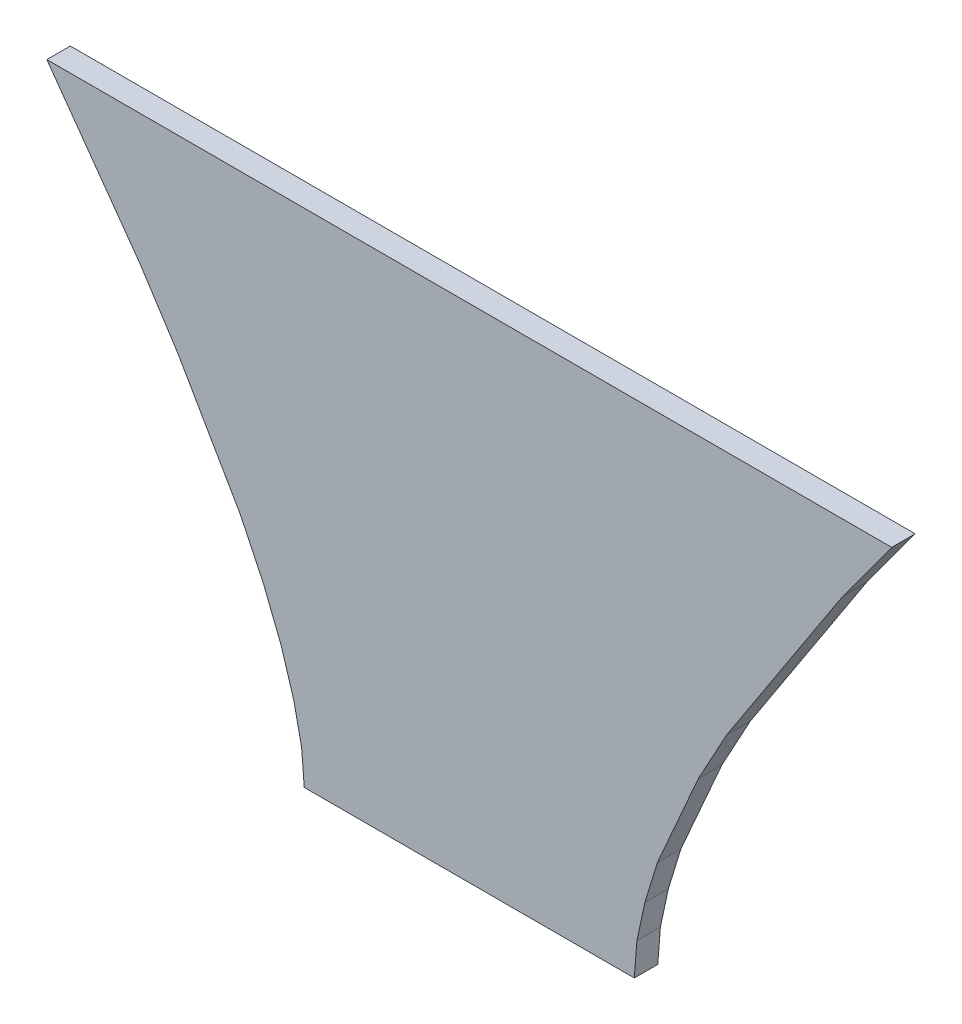
ISO-10303-21;
HEADER;
FILE_DESCRIPTION(('STEP AP214'),'2;1');
FILE_NAME('part.step','',(''),(''),'','','');
FILE_SCHEMA(('AUTOMOTIVE_DESIGN { 1 0 10303 214 1 1 1 1 }'));
ENDSEC;
DATA;
#1=APPLICATION_CONTEXT('core data for automotive mechanical design processes');
#2=APPLICATION_PROTOCOL_DEFINITION('international standard','automotive_design',2000,#1);
#3=PRODUCT_CONTEXT('',#1,'mechanical');
#4=PRODUCT('Part','Part','',(#3));
#5=PRODUCT_RELATED_PRODUCT_CATEGORY('part','',(#4));
#6=PRODUCT_DEFINITION_FORMATION('','',#4);
#7=PRODUCT_DEFINITION_CONTEXT('part definition',#1,'design');
#8=PRODUCT_DEFINITION('design','',#6,#7);
#9=PRODUCT_DEFINITION_SHAPE('','',#8);
#10=(LENGTH_UNIT() NAMED_UNIT(*) SI_UNIT(.MILLI.,.METRE.));
#11=(NAMED_UNIT(*) PLANE_ANGLE_UNIT() SI_UNIT($,.RADIAN.));
#12=(NAMED_UNIT(*) SI_UNIT($,.STERADIAN.) SOLID_ANGLE_UNIT());
#13=UNCERTAINTY_MEASURE_WITH_UNIT(LENGTH_MEASURE(1.E-05),#10,'distance_accuracy_value','');
#14=(GEOMETRIC_REPRESENTATION_CONTEXT(3) GLOBAL_UNCERTAINTY_ASSIGNED_CONTEXT((#13)) GLOBAL_UNIT_ASSIGNED_CONTEXT((#10,
#11,#12)) REPRESENTATION_CONTEXT('',''));
#15=CARTESIAN_POINT('',(0.,0.,0.));
#16=DIRECTION('',(0.,0.,1.));
#17=DIRECTION('',(1.,0.,0.));
#18=AXIS2_PLACEMENT_3D('',#15,#16,#17);
#19=CARTESIAN_POINT('',(119.449996948242,103.059997558594,0.));
#20=DIRECTION('',(-0.996930394738995,0.0782929629376174,0.));
#21=DIRECTION('',(0.0782929629376174,0.996930394738995,0.));
#22=AXIS2_PLACEMENT_3D('',#19,#20,#21);
#23=PLANE('',#22);
#24=DIRECTION('',(0.0782929629376174,0.996930394738995,0.));
#25=VECTOR('',#24,1.);
#26=CARTESIAN_POINT('',(119.449996948242,103.059997558594,0.03556));
#27=LINE('',#26,#25);
#28=CARTESIAN_POINT('',(119.449996948242,103.059997558594,0.03556));
#29=VERTEX_POINT('',#28);
#30=CARTESIAN_POINT('',(119.454002380371,103.111000061035,0.03556));
#31=VERTEX_POINT('',#30);
#32=EDGE_CURVE('E11',#29,#31,#27,.T.);
#33=ORIENTED_EDGE('',*,*,#32,.F.);
#34=DIRECTION('',(0.,0.,1.));
#35=VECTOR('',#34,1.);
#36=CARTESIAN_POINT('',(119.449996948242,103.059997558594,0.));
#37=LINE('',#36,#35);
#38=CARTESIAN_POINT('',(119.449996948242,103.059997558594,0.));
#39=VERTEX_POINT('',#38);
#40=EDGE_CURVE('E24',#39,#29,#37,.T.);
#41=ORIENTED_EDGE('',*,*,#40,.F.);
#42=DIRECTION('',(0.0782929629376174,0.996930394738995,0.));
#43=VECTOR('',#42,1.);
#44=CARTESIAN_POINT('',(119.449996948242,103.059997558594,0.));
#45=LINE('',#44,#43);
#46=CARTESIAN_POINT('',(119.454002380371,103.111000061035,0.));
#47=VERTEX_POINT('',#46);
#48=EDGE_CURVE('E154',#39,#47,#45,.T.);
#49=ORIENTED_EDGE('',*,*,#48,.T.);
#50=DIRECTION('',(0.,0.,1.));
#51=VECTOR('',#50,1.);
#52=CARTESIAN_POINT('',(119.454002380371,103.111000061035,0.));
#53=LINE('',#52,#51);
#54=EDGE_CURVE('E37',#47,#31,#53,.T.);
#55=ORIENTED_EDGE('',*,*,#54,.T.);
#56=EDGE_LOOP('',(#33,#41,#49,#55));
#57=FACE_BOUND('',#56,.T.);
#58=ADVANCED_FACE('F17',(#57),#23,.F.);
#59=CARTESIAN_POINT('',(119.454002380371,103.111000061035,0.));
#60=DIRECTION('',(-0.977798514930854,0.20954728392183,0.));
#61=DIRECTION('',(0.20954728392183,0.977798514930854,0.));
#62=AXIS2_PLACEMENT_3D('',#59,#60,#61);
#63=PLANE('',#62);
#64=DIRECTION('',(0.20954728392183,0.977798514930854,0.));
#65=VECTOR('',#64,1.);
#66=CARTESIAN_POINT('',(119.454002380371,103.111000061035,0.03556));
#67=LINE('',#66,#65);
#68=CARTESIAN_POINT('',(119.466003417969,103.166999816895,0.03556));
#69=VERTEX_POINT('',#68);
#70=EDGE_CURVE('E266',#31,#69,#67,.T.);
#71=ORIENTED_EDGE('',*,*,#70,.F.);
#72=ORIENTED_EDGE('',*,*,#54,.F.);
#73=DIRECTION('',(0.20954728392183,0.977798514930854,0.));
#74=VECTOR('',#73,1.);
#75=CARTESIAN_POINT('',(119.454002380371,103.111000061035,0.));
#76=LINE('',#75,#74);
#77=CARTESIAN_POINT('',(119.466003417969,103.166999816895,0.));
#78=VERTEX_POINT('',#77);
#79=EDGE_CURVE('E263',#47,#78,#76,.T.);
#80=ORIENTED_EDGE('',*,*,#79,.T.);
#81=DIRECTION('',(0.,0.,1.));
#82=VECTOR('',#81,1.);
#83=CARTESIAN_POINT('',(119.466003417969,103.166999816895,0.));
#84=LINE('',#83,#82);
#85=EDGE_CURVE('E261',#78,#69,#84,.T.);
#86=ORIENTED_EDGE('',*,*,#85,.T.);
#87=EDGE_LOOP('',(#71,#72,#80,#86));
#88=FACE_BOUND('',#87,.T.);
#89=ADVANCED_FACE('F274',(#88),#63,.F.);
#90=CARTESIAN_POINT('',(119.466003417969,103.166999816895,0.));
#91=DIRECTION('',(-0.956119267602671,0.292977722905569,0.));
#92=DIRECTION('',(0.292977722905569,0.956119267602671,0.));
#93=AXIS2_PLACEMENT_3D('',#90,#91,#92);
#94=PLANE('',#93);
#95=DIRECTION('',(0.292977722905569,0.956119267602671,0.));
#96=VECTOR('',#95,1.);
#97=CARTESIAN_POINT('',(119.466003417969,103.166999816895,0.03556));
#98=LINE('',#97,#96);
#99=CARTESIAN_POINT('',(119.485000610352,103.228996276855,0.03556));
#100=VERTEX_POINT('',#99);
#101=EDGE_CURVE('E258',#69,#100,#98,.T.);
#102=ORIENTED_EDGE('',*,*,#101,.F.);
#103=ORIENTED_EDGE('',*,*,#85,.F.);
#104=DIRECTION('',(0.292977722905569,0.956119267602671,0.));
#105=VECTOR('',#104,1.);
#106=CARTESIAN_POINT('',(119.466003417969,103.166999816895,0.));
#107=LINE('',#106,#105);
#108=CARTESIAN_POINT('',(119.485000610352,103.228996276855,0.));
#109=VERTEX_POINT('',#108);
#110=EDGE_CURVE('E255',#78,#109,#107,.T.);
#111=ORIENTED_EDGE('',*,*,#110,.T.);
#112=DIRECTION('',(0.,0.,1.));
#113=VECTOR('',#112,1.);
#114=CARTESIAN_POINT('',(119.485000610352,103.228996276855,0.));
#115=LINE('',#114,#113);
#116=EDGE_CURVE('E253',#109,#100,#115,.T.);
#117=ORIENTED_EDGE('',*,*,#116,.T.);
#118=EDGE_LOOP('',(#102,#103,#111,#117));
#119=FACE_BOUND('',#118,.T.);
#120=ADVANCED_FACE('F280',(#119),#94,.F.);
#121=CARTESIAN_POINT('',(119.485000610352,103.228996276855,0.));
#122=DIRECTION('',(-0.91542601011041,0.402486297919986,0.));
#123=DIRECTION('',(0.402486297919986,0.91542601011041,0.));
#124=AXIS2_PLACEMENT_3D('',#121,#122,#123);
#125=PLANE('',#124);
#126=DIRECTION('',(0.402486297919986,0.91542601011041,0.));
#127=VECTOR('',#126,1.);
#128=CARTESIAN_POINT('',(119.485000610352,103.228996276855,0.03556));
#129=LINE('',#128,#127);
#130=CARTESIAN_POINT('',(119.546997070313,103.370002746582,0.03556));
#131=VERTEX_POINT('',#130);
#132=EDGE_CURVE('E250',#100,#131,#129,.T.);
#133=ORIENTED_EDGE('',*,*,#132,.F.);
#134=ORIENTED_EDGE('',*,*,#116,.F.);
#135=DIRECTION('',(0.402486297919986,0.91542601011041,0.));
#136=VECTOR('',#135,1.);
#137=CARTESIAN_POINT('',(119.485000610352,103.228996276855,0.));
#138=LINE('',#137,#136);
#139=CARTESIAN_POINT('',(119.546997070313,103.370002746582,0.));
#140=VERTEX_POINT('',#139);
#141=EDGE_CURVE('E247',#109,#140,#138,.T.);
#142=ORIENTED_EDGE('',*,*,#141,.T.);
#143=DIRECTION('',(0.,0.,1.));
#144=VECTOR('',#143,1.);
#145=CARTESIAN_POINT('',(119.546997070313,103.370002746582,0.));
#146=LINE('',#145,#144);
#147=EDGE_CURVE('E245',#140,#131,#146,.T.);
#148=ORIENTED_EDGE('',*,*,#147,.T.);
#149=EDGE_LOOP('',(#133,#134,#142,#148));
#150=FACE_BOUND('',#149,.T.);
#151=ADVANCED_FACE('F282',(#150),#125,.F.);
#152=CARTESIAN_POINT('',(119.546997070313,103.370002746582,0.));
#153=DIRECTION('',(-0.878310198610901,0.478091199475665,0.));
#154=DIRECTION('',(0.478091199475665,0.878310198610901,0.));
#155=AXIS2_PLACEMENT_3D('',#152,#153,#154);
#156=PLANE('',#155);
#157=DIRECTION('',(0.478091199475665,0.878310198610901,0.));
#158=VECTOR('',#157,1.);
#159=CARTESIAN_POINT('',(119.546997070313,103.370002746582,0.03556));
#160=LINE('',#159,#158);
#161=CARTESIAN_POINT('',(119.589996337891,103.448997497559,0.03556));
#162=VERTEX_POINT('',#161);
#163=EDGE_CURVE('E242',#131,#162,#160,.T.);
#164=ORIENTED_EDGE('',*,*,#163,.F.);
#165=ORIENTED_EDGE('',*,*,#147,.F.);
#166=DIRECTION('',(0.478091199475665,0.878310198610901,0.));
#167=VECTOR('',#166,1.);
#168=CARTESIAN_POINT('',(119.546997070313,103.370002746582,0.));
#169=LINE('',#168,#167);
#170=CARTESIAN_POINT('',(119.589996337891,103.448997497559,0.));
#171=VERTEX_POINT('',#170);
#172=EDGE_CURVE('E239',#140,#171,#169,.T.);
#173=ORIENTED_EDGE('',*,*,#172,.T.);
#174=DIRECTION('',(0.,0.,1.));
#175=VECTOR('',#174,1.);
#176=CARTESIAN_POINT('',(119.589996337891,103.448997497559,0.));
#177=LINE('',#176,#175);
#178=EDGE_CURVE('E237',#171,#162,#177,.T.);
#179=ORIENTED_EDGE('',*,*,#178,.T.);
#180=EDGE_LOOP('',(#164,#165,#173,#179));
#181=FACE_BOUND('',#180,.T.);
#182=ADVANCED_FACE('F287',(#181),#156,.F.);
#183=CARTESIAN_POINT('',(119.589996337891,103.448997497559,0.));
#184=DIRECTION('',(-0.8377344268652,0.546077860789865,0.));
#185=DIRECTION('',(0.546077860789864,0.8377344268652,0.));
#186=AXIS2_PLACEMENT_3D('',#183,#184,#185);
#187=PLANE('',#186);
#188=DIRECTION('',(0.546077860789865,0.8377344268652,0.));
#189=VECTOR('',#188,1.);
#190=CARTESIAN_POINT('',(119.589996337891,103.448997497559,0.03556));
#191=LINE('',#190,#189);
#192=CARTESIAN_POINT('',(119.765998840332,103.71900177002,0.03556));
#193=VERTEX_POINT('',#192);
#194=EDGE_CURVE('E234',#162,#193,#191,.T.);
#195=ORIENTED_EDGE('',*,*,#194,.F.);
#196=ORIENTED_EDGE('',*,*,#178,.F.);
#197=DIRECTION('',(0.546077860789865,0.8377344268652,0.));
#198=VECTOR('',#197,1.);
#199=CARTESIAN_POINT('',(119.589996337891,103.448997497559,0.));
#200=LINE('',#199,#198);
#201=CARTESIAN_POINT('',(119.765998840332,103.71900177002,0.));
#202=VERTEX_POINT('',#201);
#203=EDGE_CURVE('E231',#171,#202,#200,.T.);
#204=ORIENTED_EDGE('',*,*,#203,.T.);
#205=DIRECTION('',(0.,0.,1.));
#206=VECTOR('',#205,1.);
#207=CARTESIAN_POINT('',(119.765998840332,103.71900177002,0.));
#208=LINE('',#207,#206);
#209=EDGE_CURVE('E229',#202,#193,#208,.T.);
#210=ORIENTED_EDGE('',*,*,#209,.T.);
#211=EDGE_LOOP('',(#195,#196,#204,#210));
#212=FACE_BOUND('',#211,.T.);
#213=ADVANCED_FACE('F290',(#212),#187,.F.);
#214=CARTESIAN_POINT('',(119.765998840332,103.71900177002,0.));
#215=DIRECTION('',(-0.80666257383119,0.591012260431237,0.));
#216=DIRECTION('',(0.591012260431237,0.80666257383119,0.));
#217=AXIS2_PLACEMENT_3D('',#214,#215,#216);
#218=PLANE('',#217);
#219=DIRECTION('',(0.591012260431237,0.80666257383119,0.));
#220=VECTOR('',#219,1.);
#221=CARTESIAN_POINT('',(119.765998840332,103.71900177002,0.03556));
#222=LINE('',#221,#220);
#223=CARTESIAN_POINT('',(119.839996337891,103.819999694824,0.03556));
#224=VERTEX_POINT('',#223);
#225=EDGE_CURVE('E226',#193,#224,#222,.T.);
#226=ORIENTED_EDGE('',*,*,#225,.F.);
#227=ORIENTED_EDGE('',*,*,#209,.F.);
#228=DIRECTION('',(0.591012260431237,0.80666257383119,0.));
#229=VECTOR('',#228,1.);
#230=CARTESIAN_POINT('',(119.765998840332,103.71900177002,0.));
#231=LINE('',#230,#229);
#232=CARTESIAN_POINT('',(119.839996337891,103.819999694824,0.));
#233=VERTEX_POINT('',#232);
#234=EDGE_CURVE('E223',#202,#233,#231,.T.);
#235=ORIENTED_EDGE('',*,*,#234,.T.);
#236=DIRECTION('',(0.,0.,1.));
#237=VECTOR('',#236,1.);
#238=CARTESIAN_POINT('',(119.839996337891,103.819999694824,0.));
#239=LINE('',#238,#237);
#240=EDGE_CURVE('E221',#233,#224,#239,.T.);
#241=ORIENTED_EDGE('',*,*,#240,.T.);
#242=EDGE_LOOP('',(#226,#227,#235,#241));
#243=FACE_BOUND('',#242,.T.);
#244=ADVANCED_FACE('F295',(#243),#218,.F.);
#245=CARTESIAN_POINT('',(119.839996337891,103.819999694824,0.));
#246=DIRECTION('',(0.,-1.,0.));
#247=DIRECTION('',(-1.,0.,0.));
#248=AXIS2_PLACEMENT_3D('',#245,#246,#247);
#249=PLANE('',#248);
#250=DIRECTION('',(-1.,0.,0.));
#251=VECTOR('',#250,1.);
#252=CARTESIAN_POINT('',(119.839996337891,103.819999694824,0.03556));
#253=LINE('',#252,#251);
#254=CARTESIAN_POINT('',(118.559997558594,103.819999694824,0.03556));
#255=VERTEX_POINT('',#254);
#256=EDGE_CURVE('E218',#224,#255,#253,.T.);
#257=ORIENTED_EDGE('',*,*,#256,.F.);
#258=ORIENTED_EDGE('',*,*,#240,.F.);
#259=DIRECTION('',(-1.,0.,0.));
#260=VECTOR('',#259,1.);
#261=CARTESIAN_POINT('',(119.839996337891,103.819999694824,0.));
#262=LINE('',#261,#260);
#263=CARTESIAN_POINT('',(118.559997558594,103.819999694824,0.));
#264=VERTEX_POINT('',#263);
#265=EDGE_CURVE('E215',#233,#264,#262,.T.);
#266=ORIENTED_EDGE('',*,*,#265,.T.);
#267=DIRECTION('',(0.,0.,1.));
#268=VECTOR('',#267,1.);
#269=CARTESIAN_POINT('',(118.559997558594,103.819999694824,0.));
#270=LINE('',#269,#268);
#271=EDGE_CURVE('E213',#264,#255,#270,.T.);
#272=ORIENTED_EDGE('',*,*,#271,.T.);
#273=EDGE_LOOP('',(#257,#258,#266,#272));
#274=FACE_BOUND('',#273,.T.);
#275=ADVANCED_FACE('F298',(#274),#249,.F.);
#276=CARTESIAN_POINT('',(118.559997558594,103.819999694824,0.));
#277=DIRECTION('',(0.813175589208481,0.582018437092365,0.));
#278=DIRECTION('',(0.582018437092365,-0.813175589208481,0.));
#279=AXIS2_PLACEMENT_3D('',#276,#277,#278);
#280=PLANE('',#279);
#281=DIRECTION('',(0.582018437092365,-0.813175589208481,0.));
#282=VECTOR('',#281,1.);
#283=CARTESIAN_POINT('',(118.559997558594,103.819999694824,0.03556));
#284=LINE('',#283,#282);
#285=CARTESIAN_POINT('',(118.700996398926,103.623001098633,0.03556));
#286=VERTEX_POINT('',#285);
#287=EDGE_CURVE('E210',#255,#286,#284,.T.);
#288=ORIENTED_EDGE('',*,*,#287,.F.);
#289=ORIENTED_EDGE('',*,*,#271,.F.);
#290=DIRECTION('',(0.582018437092365,-0.813175589208481,0.));
#291=VECTOR('',#290,1.);
#292=CARTESIAN_POINT('',(118.559997558594,103.819999694824,0.));
#293=LINE('',#292,#291);
#294=CARTESIAN_POINT('',(118.700996398926,103.623001098633,0.));
#295=VERTEX_POINT('',#294);
#296=EDGE_CURVE('E207',#264,#295,#293,.T.);
#297=ORIENTED_EDGE('',*,*,#296,.T.);
#298=DIRECTION('',(0.,0.,1.));
#299=VECTOR('',#298,1.);
#300=CARTESIAN_POINT('',(118.700996398926,103.623001098633,0.));
#301=LINE('',#300,#299);
#302=EDGE_CURVE('E205',#295,#286,#301,.T.);
#303=ORIENTED_EDGE('',*,*,#302,.T.);
#304=EDGE_LOOP('',(#288,#289,#297,#303));
#305=FACE_BOUND('',#304,.T.);
#306=ADVANCED_FACE('F303',(#305),#280,.F.);
#307=CARTESIAN_POINT('',(118.700996398926,103.623001098633,0.));
#308=DIRECTION('',(0.840555173420179,0.541725945877225,0.));
#309=DIRECTION('',(0.541725945877225,-0.840555173420179,0.));
#310=AXIS2_PLACEMENT_3D('',#307,#308,#309);
#311=PLANE('',#310);
#312=DIRECTION('',(0.541725945877225,-0.840555173420179,0.));
#313=VECTOR('',#312,1.);
#314=CARTESIAN_POINT('',(118.700996398926,103.623001098633,0.03556));
#315=LINE('',#314,#313);
#316=CARTESIAN_POINT('',(118.759002685547,103.532997131348,0.03556));
#317=VERTEX_POINT('',#316);
#318=EDGE_CURVE('E202',#286,#317,#315,.T.);
#319=ORIENTED_EDGE('',*,*,#318,.F.);
#320=ORIENTED_EDGE('',*,*,#302,.F.);
#321=DIRECTION('',(0.541725945877225,-0.840555173420179,0.));
#322=VECTOR('',#321,1.);
#323=CARTESIAN_POINT('',(118.700996398926,103.623001098633,0.));
#324=LINE('',#323,#322);
#325=CARTESIAN_POINT('',(118.759002685547,103.532997131348,0.));
#326=VERTEX_POINT('',#325);
#327=EDGE_CURVE('E199',#295,#326,#324,.T.);
#328=ORIENTED_EDGE('',*,*,#327,.T.);
#329=DIRECTION('',(0.,0.,1.));
#330=VECTOR('',#329,1.);
#331=CARTESIAN_POINT('',(118.759002685547,103.532997131348,0.));
#332=LINE('',#331,#330);
#333=EDGE_CURVE('E197',#326,#317,#332,.T.);
#334=ORIENTED_EDGE('',*,*,#333,.T.);
#335=EDGE_LOOP('',(#319,#320,#328,#334));
#336=FACE_BOUND('',#335,.T.);
#337=ADVANCED_FACE('F306',(#336),#311,.F.);
#338=CARTESIAN_POINT('',(118.759002685547,103.532997131348,0.));
#339=DIRECTION('',(0.866280078925766,0.499558630048935,0.));
#340=DIRECTION('',(0.499558630048935,-0.866280078925766,0.));
#341=AXIS2_PLACEMENT_3D('',#338,#339,#340);
#342=PLANE('',#341);
#343=DIRECTION('',(0.499558630048935,-0.866280078925766,0.));
#344=VECTOR('',#343,1.);
#345=CARTESIAN_POINT('',(118.759002685547,103.532997131348,0.03556));
#346=LINE('',#345,#344);
#347=CARTESIAN_POINT('',(118.852996826172,103.370002746582,0.03556));
#348=VERTEX_POINT('',#347);
#349=EDGE_CURVE('E194',#317,#348,#346,.T.);
#350=ORIENTED_EDGE('',*,*,#349,.F.);
#351=ORIENTED_EDGE('',*,*,#333,.F.);
#352=DIRECTION('',(0.499558630048935,-0.866280078925766,0.));
#353=VECTOR('',#352,1.);
#354=CARTESIAN_POINT('',(118.759002685547,103.532997131348,0.));
#355=LINE('',#354,#353);
#356=CARTESIAN_POINT('',(118.852996826172,103.370002746582,0.));
#357=VERTEX_POINT('',#356);
#358=EDGE_CURVE('E191',#326,#357,#355,.T.);
#359=ORIENTED_EDGE('',*,*,#358,.T.);
#360=DIRECTION('',(0.,0.,1.));
#361=VECTOR('',#360,1.);
#362=CARTESIAN_POINT('',(118.852996826172,103.370002746582,0.));
#363=LINE('',#362,#361);
#364=EDGE_CURVE('E189',#357,#348,#363,.T.);
#365=ORIENTED_EDGE('',*,*,#364,.T.);
#366=EDGE_LOOP('',(#350,#351,#359,#365));
#367=FACE_BOUND('',#366,.T.);
#368=ADVANCED_FACE('F311',(#367),#342,.F.);
#369=CARTESIAN_POINT('',(118.852996826172,103.370002746582,0.));
#370=DIRECTION('',(0.901711192194647,0.432338901639569,0.));
#371=DIRECTION('',(0.432338901639569,-0.901711192194647,0.));
#372=AXIS2_PLACEMENT_3D('',#369,#370,#371);
#373=PLANE('',#372);
#374=DIRECTION('',(0.432338901639569,-0.901711192194647,0.));
#375=VECTOR('',#374,1.);
#376=CARTESIAN_POINT('',(118.852996826172,103.370002746582,0.03556));
#377=LINE('',#376,#375);
#378=CARTESIAN_POINT('',(118.888000488281,103.296997070313,0.03556));
#379=VERTEX_POINT('',#378);
#380=EDGE_CURVE('E186',#348,#379,#377,.T.);
#381=ORIENTED_EDGE('',*,*,#380,.F.);
#382=ORIENTED_EDGE('',*,*,#364,.F.);
#383=DIRECTION('',(0.432338901639569,-0.901711192194647,0.));
#384=VECTOR('',#383,1.);
#385=CARTESIAN_POINT('',(118.852996826172,103.370002746582,0.));
#386=LINE('',#385,#384);
#387=CARTESIAN_POINT('',(118.888000488281,103.296997070313,0.));
#388=VERTEX_POINT('',#387);
#389=EDGE_CURVE('E183',#357,#388,#386,.T.);
#390=ORIENTED_EDGE('',*,*,#389,.T.);
#391=DIRECTION('',(0.,0.,1.));
#392=VECTOR('',#391,1.);
#393=CARTESIAN_POINT('',(118.888000488281,103.296997070313,0.));
#394=LINE('',#393,#392);
#395=EDGE_CURVE('E181',#388,#379,#394,.T.);
#396=ORIENTED_EDGE('',*,*,#395,.T.);
#397=EDGE_LOOP('',(#381,#382,#390,#396));
#398=FACE_BOUND('',#397,.T.);
#399=ADVANCED_FACE('F314',(#398),#373,.F.);
#400=CARTESIAN_POINT('',(118.888000488281,103.296997070313,0.));
#401=DIRECTION('',(0.929415787299834,0.369034272551791,0.));
#402=DIRECTION('',(0.369034272551791,-0.929415787299834,0.));
#403=AXIS2_PLACEMENT_3D('',#400,#401,#402);
#404=PLANE('',#403);
#405=DIRECTION('',(0.369034272551791,-0.929415787299834,0.));
#406=VECTOR('',#405,1.);
#407=CARTESIAN_POINT('',(118.888000488281,103.296997070313,0.03556));
#408=LINE('',#407,#406);
#409=CARTESIAN_POINT('',(118.915000915527,103.228996276855,0.03556));
#410=VERTEX_POINT('',#409);
#411=EDGE_CURVE('E178',#379,#410,#408,.T.);
#412=ORIENTED_EDGE('',*,*,#411,.F.);
#413=ORIENTED_EDGE('',*,*,#395,.F.);
#414=DIRECTION('',(0.369034272551791,-0.929415787299834,0.));
#415=VECTOR('',#414,1.);
#416=CARTESIAN_POINT('',(118.888000488281,103.296997070313,0.));
#417=LINE('',#416,#415);
#418=CARTESIAN_POINT('',(118.915000915527,103.228996276855,0.));
#419=VERTEX_POINT('',#418);
#420=EDGE_CURVE('E175',#388,#419,#417,.T.);
#421=ORIENTED_EDGE('',*,*,#420,.T.);
#422=DIRECTION('',(0.,0.,1.));
#423=VECTOR('',#422,1.);
#424=CARTESIAN_POINT('',(118.915000915527,103.228996276855,0.));
#425=LINE('',#424,#423);
#426=EDGE_CURVE('E173',#419,#410,#425,.T.);
#427=ORIENTED_EDGE('',*,*,#426,.T.);
#428=EDGE_LOOP('',(#412,#413,#421,#427));
#429=FACE_BOUND('',#428,.T.);
#430=ADVANCED_FACE('F319',(#429),#404,.F.);
#431=CARTESIAN_POINT('',(118.915000915527,103.228996276855,0.));
#432=DIRECTION('',(0.956119267602671,0.292977722905569,0.));
#433=DIRECTION('',(0.292977722905569,-0.956119267602671,0.));
#434=AXIS2_PLACEMENT_3D('',#431,#432,#433);
#435=PLANE('',#434);
#436=DIRECTION('',(0.292977722905569,-0.956119267602671,0.));
#437=VECTOR('',#436,1.);
#438=CARTESIAN_POINT('',(118.915000915527,103.228996276855,0.03556));
#439=LINE('',#438,#437);
#440=CARTESIAN_POINT('',(118.93399810791,103.166999816895,0.03556));
#441=VERTEX_POINT('',#440);
#442=EDGE_CURVE('E170',#410,#441,#439,.T.);
#443=ORIENTED_EDGE('',*,*,#442,.F.);
#444=ORIENTED_EDGE('',*,*,#426,.F.);
#445=DIRECTION('',(0.292977722905569,-0.956119267602671,0.));
#446=VECTOR('',#445,1.);
#447=CARTESIAN_POINT('',(118.915000915527,103.228996276855,0.));
#448=LINE('',#447,#446);
#449=CARTESIAN_POINT('',(118.93399810791,103.166999816895,0.));
#450=VERTEX_POINT('',#449);
#451=EDGE_CURVE('E167',#419,#450,#448,.T.);
#452=ORIENTED_EDGE('',*,*,#451,.T.);
#453=DIRECTION('',(0.,0.,1.));
#454=VECTOR('',#453,1.);
#455=CARTESIAN_POINT('',(118.93399810791,103.166999816895,0.));
#456=LINE('',#455,#454);
#457=EDGE_CURVE('E165',#450,#441,#456,.T.);
#458=ORIENTED_EDGE('',*,*,#457,.T.);
#459=EDGE_LOOP('',(#443,#444,#452,#458));
#460=FACE_BOUND('',#459,.T.);
#461=ADVANCED_FACE('F322',(#460),#435,.F.);
#462=CARTESIAN_POINT('',(118.93399810791,103.166999816895,0.));
#463=DIRECTION('',(0.977798514930854,0.20954728392183,0.));
#464=DIRECTION('',(0.20954728392183,-0.977798514930854,0.));
#465=AXIS2_PLACEMENT_3D('',#462,#463,#464);
#466=PLANE('',#465);
#467=DIRECTION('',(0.20954728392183,-0.977798514930854,0.));
#468=VECTOR('',#467,1.);
#469=CARTESIAN_POINT('',(118.93399810791,103.166999816895,0.03556));
#470=LINE('',#469,#468);
#471=CARTESIAN_POINT('',(118.945999145508,103.111000061035,0.03556));
#472=VERTEX_POINT('',#471);
#473=EDGE_CURVE('E162',#441,#472,#470,.T.);
#474=ORIENTED_EDGE('',*,*,#473,.F.);
#475=ORIENTED_EDGE('',*,*,#457,.F.);
#476=DIRECTION('',(0.20954728392183,-0.977798514930854,0.));
#477=VECTOR('',#476,1.);
#478=CARTESIAN_POINT('',(118.93399810791,103.166999816895,0.));
#479=LINE('',#478,#477);
#480=CARTESIAN_POINT('',(118.945999145508,103.111000061035,0.));
#481=VERTEX_POINT('',#480);
#482=EDGE_CURVE('E160',#450,#481,#479,.T.);
#483=ORIENTED_EDGE('',*,*,#482,.T.);
#484=DIRECTION('',(0.,0.,1.));
#485=VECTOR('',#484,1.);
#486=CARTESIAN_POINT('',(118.945999145508,103.111000061035,0.));
#487=LINE('',#486,#485);
#488=EDGE_CURVE('E145',#481,#472,#487,.T.);
#489=ORIENTED_EDGE('',*,*,#488,.T.);
#490=EDGE_LOOP('',(#474,#475,#483,#489));
#491=FACE_BOUND('',#490,.T.);
#492=ADVANCED_FACE('F325',(#491),#466,.F.);
#493=CARTESIAN_POINT('',(118.945999145508,103.111000061035,0.));
#494=DIRECTION('',(0.996942023803503,0.0781447450221444,0.));
#495=DIRECTION('',(0.0781447450221444,-0.996942023803503,0.));
#496=AXIS2_PLACEMENT_3D('',#493,#494,#495);
#497=PLANE('',#496);
#498=DIRECTION('',(0.0781447450221444,-0.996942023803503,0.));
#499=VECTOR('',#498,1.);
#500=CARTESIAN_POINT('',(118.945999145508,103.111000061035,0.03556));
#501=LINE('',#500,#499);
#502=CARTESIAN_POINT('',(118.949996948242,103.059997558594,0.03556));
#503=VERTEX_POINT('',#502);
#504=EDGE_CURVE('E149',#472,#503,#501,.T.);
#505=ORIENTED_EDGE('',*,*,#504,.F.);
#506=ORIENTED_EDGE('',*,*,#488,.F.);
#507=DIRECTION('',(0.0781447450221444,-0.996942023803503,0.));
#508=VECTOR('',#507,1.);
#509=CARTESIAN_POINT('',(118.945999145508,103.111000061035,0.));
#510=LINE('',#509,#508);
#511=CARTESIAN_POINT('',(118.949996948242,103.059997558594,0.));
#512=VERTEX_POINT('',#511);
#513=EDGE_CURVE('E141',#481,#512,#510,.T.);
#514=ORIENTED_EDGE('',*,*,#513,.T.);
#515=DIRECTION('',(0.,0.,1.));
#516=VECTOR('',#515,1.);
#517=CARTESIAN_POINT('',(118.949996948242,103.059997558594,0.));
#518=LINE('',#517,#516);
#519=EDGE_CURVE('E131',#512,#503,#518,.T.);
#520=ORIENTED_EDGE('',*,*,#519,.T.);
#521=EDGE_LOOP('',(#505,#506,#514,#520));
#522=FACE_BOUND('',#521,.T.);
#523=ADVANCED_FACE('F144',(#522),#497,.F.);
#524=CARTESIAN_POINT('',(118.949996948242,103.059997558594,0.));
#525=DIRECTION('',(0.,1.,0.));
#526=DIRECTION('',(1.,0.,0.));
#527=AXIS2_PLACEMENT_3D('',#524,#525,#526);
#528=PLANE('',#527);
#529=DIRECTION('',(1.,0.,0.));
#530=VECTOR('',#529,1.);
#531=CARTESIAN_POINT('',(118.949996948242,103.059997558594,0.03556));
#532=LINE('',#531,#530);
#533=EDGE_CURVE('E137',#503,#29,#532,.T.);
#534=ORIENTED_EDGE('',*,*,#533,.F.);
#535=ORIENTED_EDGE('',*,*,#519,.F.);
#536=DIRECTION('',(1.,0.,0.));
#537=VECTOR('',#536,1.);
#538=CARTESIAN_POINT('',(118.949996948242,103.059997558594,0.));
#539=LINE('',#538,#537);
#540=EDGE_CURVE('E135',#512,#39,#539,.T.);
#541=ORIENTED_EDGE('',*,*,#540,.T.);
#542=ORIENTED_EDGE('',*,*,#40,.T.);
#543=EDGE_LOOP('',(#534,#535,#541,#542));
#544=FACE_BOUND('',#543,.T.);
#545=ADVANCED_FACE('F133',(#544),#528,.F.);
#546=CARTESIAN_POINT('',(119.449996948242,103.059997558594,0.));
#547=DIRECTION('',(0.,0.,1.));
#548=DIRECTION('',(1.,0.,0.));
#549=AXIS2_PLACEMENT_3D('',#546,#547,#548);
#550=PLANE('',#549);
#551=ORIENTED_EDGE('',*,*,#540,.F.);
#552=ORIENTED_EDGE('',*,*,#513,.F.);
#553=ORIENTED_EDGE('',*,*,#482,.F.);
#554=ORIENTED_EDGE('',*,*,#451,.F.);
#555=ORIENTED_EDGE('',*,*,#420,.F.);
#556=ORIENTED_EDGE('',*,*,#389,.F.);
#557=ORIENTED_EDGE('',*,*,#358,.F.);
#558=ORIENTED_EDGE('',*,*,#327,.F.);
#559=ORIENTED_EDGE('',*,*,#296,.F.);
#560=ORIENTED_EDGE('',*,*,#265,.F.);
#561=ORIENTED_EDGE('',*,*,#234,.F.);
#562=ORIENTED_EDGE('',*,*,#203,.F.);
#563=ORIENTED_EDGE('',*,*,#172,.F.);
#564=ORIENTED_EDGE('',*,*,#141,.F.);
#565=ORIENTED_EDGE('',*,*,#110,.F.);
#566=ORIENTED_EDGE('',*,*,#79,.F.);
#567=ORIENTED_EDGE('',*,*,#48,.F.);
#568=EDGE_LOOP('',(#551,#552,#553,#554,#555,#556,#557,#558,#559,#560,#561,#562,#563,#564,#565,
#566,#567));
#569=FACE_BOUND('',#568,.T.);
#570=ADVANCED_FACE('F152',(#569),#550,.F.);
#571=CARTESIAN_POINT('',(119.449996948242,103.059997558594,0.03556));
#572=DIRECTION('',(0.,0.,1.));
#573=DIRECTION('',(1.,0.,0.));
#574=AXIS2_PLACEMENT_3D('',#571,#572,#573);
#575=PLANE('',#574);
#576=ORIENTED_EDGE('',*,*,#32,.T.);
#577=ORIENTED_EDGE('',*,*,#70,.T.);
#578=ORIENTED_EDGE('',*,*,#101,.T.);
#579=ORIENTED_EDGE('',*,*,#132,.T.);
#580=ORIENTED_EDGE('',*,*,#163,.T.);
#581=ORIENTED_EDGE('',*,*,#194,.T.);
#582=ORIENTED_EDGE('',*,*,#225,.T.);
#583=ORIENTED_EDGE('',*,*,#256,.T.);
#584=ORIENTED_EDGE('',*,*,#287,.T.);
#585=ORIENTED_EDGE('',*,*,#318,.T.);
#586=ORIENTED_EDGE('',*,*,#349,.T.);
#587=ORIENTED_EDGE('',*,*,#380,.T.);
#588=ORIENTED_EDGE('',*,*,#411,.T.);
#589=ORIENTED_EDGE('',*,*,#442,.T.);
#590=ORIENTED_EDGE('',*,*,#473,.T.);
#591=ORIENTED_EDGE('',*,*,#504,.T.);
#592=ORIENTED_EDGE('',*,*,#533,.T.);
#593=EDGE_LOOP('',(#576,#577,#578,#579,#580,#581,#582,#583,#584,#585,#586,#587,#588,#589,#590,
#591,#592));
#594=FACE_BOUND('',#593,.T.);
#595=ADVANCED_FACE('F277',(#594),#575,.T.);
#596=CLOSED_SHELL('',(#58,#89,#120,#151,#182,#213,#244,#275,#306,#337,#368,#399,#430,#461,#492,
#523,#545,#570,#595));
#597=MANIFOLD_SOLID_BREP('B1',#596);
#598=ADVANCED_BREP_SHAPE_REPRESENTATION('',(#18,#597),#14);
#599=SHAPE_DEFINITION_REPRESENTATION(#9,#598);
ENDSEC;
END-ISO-10303-21;
